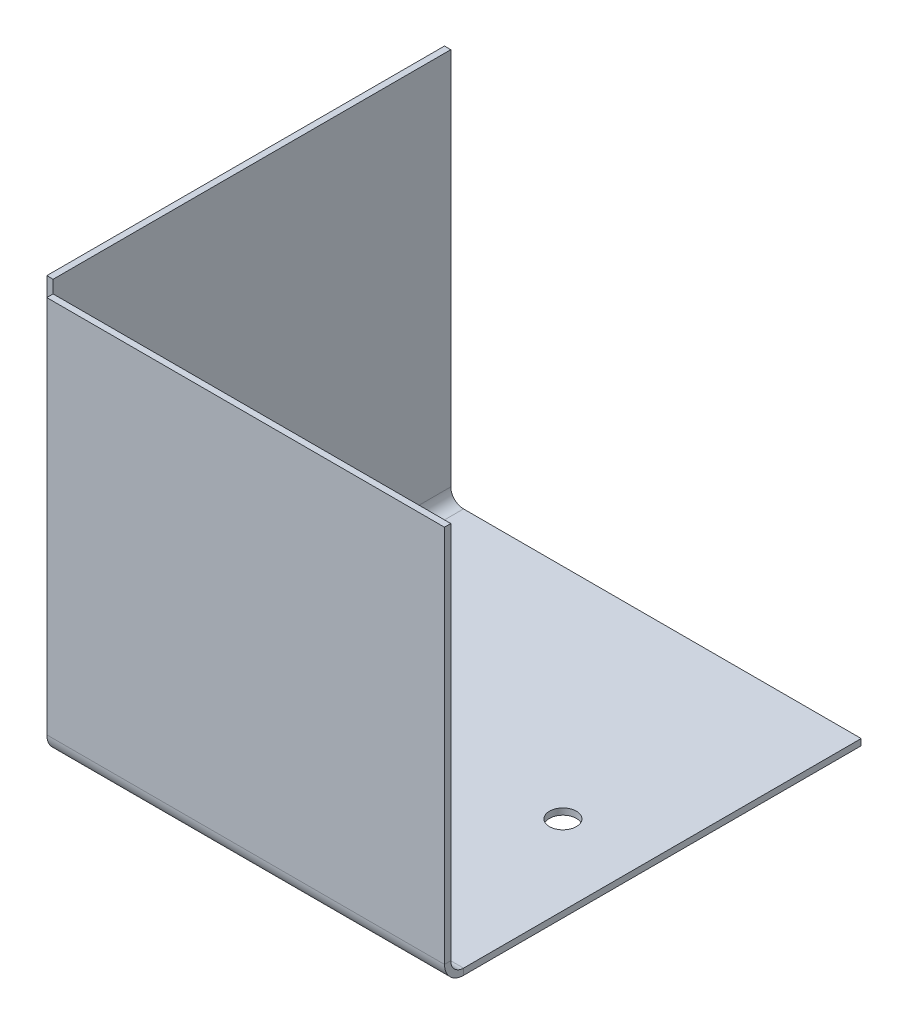
ISO-10303-21;
HEADER;
FILE_DESCRIPTION(('STEP AP214'),'2;1');
FILE_NAME('part.step','',(''),(''),'','','');
FILE_SCHEMA(('AUTOMOTIVE_DESIGN { 1 0 10303 214 1 1 1 1 }'));
ENDSEC;
DATA;
#1=APPLICATION_CONTEXT('core data for automotive mechanical design processes');
#2=APPLICATION_PROTOCOL_DEFINITION('international standard','automotive_design',2000,#1);
#3=PRODUCT_CONTEXT('',#1,'mechanical');
#4=PRODUCT('Part','Part','',(#3));
#5=PRODUCT_RELATED_PRODUCT_CATEGORY('part','',(#4));
#6=PRODUCT_DEFINITION_FORMATION('','',#4);
#7=PRODUCT_DEFINITION_CONTEXT('part definition',#1,'design');
#8=PRODUCT_DEFINITION('design','',#6,#7);
#9=PRODUCT_DEFINITION_SHAPE('','',#8);
#10=(LENGTH_UNIT() NAMED_UNIT(*) SI_UNIT(.MILLI.,.METRE.));
#11=(NAMED_UNIT(*) PLANE_ANGLE_UNIT() SI_UNIT($,.RADIAN.));
#12=(NAMED_UNIT(*) SI_UNIT($,.STERADIAN.) SOLID_ANGLE_UNIT());
#13=UNCERTAINTY_MEASURE_WITH_UNIT(LENGTH_MEASURE(1.E-05),#10,'distance_accuracy_value','');
#14=(GEOMETRIC_REPRESENTATION_CONTEXT(3) GLOBAL_UNCERTAINTY_ASSIGNED_CONTEXT((#13)) GLOBAL_UNIT_ASSIGNED_CONTEXT((#10,
#11,#12)) REPRESENTATION_CONTEXT('',''));
#15=CARTESIAN_POINT('',(0.,0.,0.));
#16=DIRECTION('',(0.,0.,1.));
#17=DIRECTION('',(1.,0.,0.));
#18=AXIS2_PLACEMENT_3D('',#15,#16,#17);
#19=CARTESIAN_POINT('',(50.,-1.5875,-50.));
#20=DIRECTION('',(1.,0.,0.));
#21=DIRECTION('',(0.,0.,-1.));
#22=AXIS2_PLACEMENT_3D('',#19,#20,#21);
#23=PLANE('',#22);
#24=DIRECTION('',(0.,0.,-1.));
#25=VECTOR('',#24,1.);
#26=CARTESIAN_POINT('',(50.,0.,-50.));
#27=LINE('',#26,#25);
#28=CARTESIAN_POINT('',(50.,0.,50.));
#29=VERTEX_POINT('',#28);
#30=CARTESIAN_POINT('',(50.,0.,-50.));
#31=VERTEX_POINT('',#30);
#32=EDGE_CURVE('E119',#29,#31,#27,.T.);
#33=ORIENTED_EDGE('',*,*,#32,.F.);
#34=DIRECTION('',(0.,1.,0.));
#35=VECTOR('',#34,1.);
#36=CARTESIAN_POINT('',(50.,-1.5875,50.));
#37=LINE('',#36,#35);
#38=CARTESIAN_POINT('',(50.,-1.58750000000002,50.));
#39=VERTEX_POINT('',#38);
#40=EDGE_CURVE('E13',#39,#29,#37,.T.);
#41=ORIENTED_EDGE('',*,*,#40,.F.);
#42=DIRECTION('',(0.,0.,-1.));
#43=VECTOR('',#42,1.);
#44=CARTESIAN_POINT('',(50.,-1.5875,-50.));
#45=LINE('',#44,#43);
#46=CARTESIAN_POINT('',(50.,-1.5875,-50.));
#47=VERTEX_POINT('',#46);
#48=EDGE_CURVE('E134',#39,#47,#45,.T.);
#49=ORIENTED_EDGE('',*,*,#48,.T.);
#50=DIRECTION('',(0.,1.,0.));
#51=VECTOR('',#50,1.);
#52=CARTESIAN_POINT('',(50.,-1.5875,-50.));
#53=LINE('',#52,#51);
#54=EDGE_CURVE('E80',#47,#31,#53,.T.);
#55=ORIENTED_EDGE('',*,*,#54,.T.);
#56=EDGE_LOOP('',(#33,#41,#49,#55));
#57=FACE_BOUND('',#56,.T.);
#58=ADVANCED_FACE('F77',(#57),#23,.T.);
#59=CARTESIAN_POINT('',(-50.,-1.5875,-50.));
#60=DIRECTION('',(0.,0.,-1.));
#61=DIRECTION('',(-1.,0.,0.));
#62=AXIS2_PLACEMENT_3D('',#59,#60,#61);
#63=PLANE('',#62);
#64=DIRECTION('',(-1.,0.,0.));
#65=VECTOR('',#64,1.);
#66=CARTESIAN_POINT('',(-50.,0.,-50.));
#67=LINE('',#66,#65);
#68=CARTESIAN_POINT('',(-50.,0.,-50.));
#69=VERTEX_POINT('',#68);
#70=EDGE_CURVE('E124',#31,#69,#67,.T.);
#71=ORIENTED_EDGE('',*,*,#70,.F.);
#72=ORIENTED_EDGE('',*,*,#54,.F.);
#73=DIRECTION('',(-1.,0.,0.));
#74=VECTOR('',#73,1.);
#75=CARTESIAN_POINT('',(-50.,-1.5875,-50.));
#76=LINE('',#75,#74);
#77=CARTESIAN_POINT('',(-50.,-1.5875,-50.));
#78=VERTEX_POINT('',#77);
#79=EDGE_CURVE('E208',#47,#78,#76,.T.);
#80=ORIENTED_EDGE('',*,*,#79,.T.);
#81=DIRECTION('',(0.,1.,0.));
#82=VECTOR('',#81,1.);
#83=CARTESIAN_POINT('',(-50.,-1.5875,-50.));
#84=LINE('',#83,#82);
#85=EDGE_CURVE('E215',#78,#69,#84,.T.);
#86=ORIENTED_EDGE('',*,*,#85,.T.);
#87=EDGE_LOOP('',(#71,#72,#80,#86));
#88=FACE_BOUND('',#87,.T.);
#89=ADVANCED_FACE('F218',(#88),#63,.T.);
#90=CARTESIAN_POINT('',(0.,-1.5875,0.));
#91=DIRECTION('',(0.,1.,0.));
#92=DIRECTION('',(0.,0.,1.));
#93=AXIS2_PLACEMENT_3D('',#90,#91,#92);
#94=PLANE('',#93);
#95=CARTESIAN_POINT('',(-30.,-1.58750000000002,4.99999999999999));
#96=DIRECTION('',(0.,1.,0.));
#97=DIRECTION('',(0.,0.,1.));
#98=AXIS2_PLACEMENT_3D('',#95,#96,#97);
#99=CIRCLE('',#98,3.3782);
#100=CARTESIAN_POINT('',(-30.,-1.58750000000002,8.37819999999999));
#101=VERTEX_POINT('',#100);
#102=EDGE_CURVE('E318',#101,#101,#99,.T.);
#103=ORIENTED_EDGE('',*,*,#102,.T.);
#104=EDGE_LOOP('',(#103));
#105=FACE_BOUND('',#104,.T.);
#106=CARTESIAN_POINT('',(30.,-1.58750000000002,4.99999999999999));
#107=DIRECTION('',(0.,1.,0.));
#108=DIRECTION('',(0.,0.,1.));
#109=AXIS2_PLACEMENT_3D('',#106,#107,#108);
#110=CIRCLE('',#109,3.3782);
#111=CARTESIAN_POINT('',(30.,-1.58750000000002,8.37819999999999));
#112=VERTEX_POINT('',#111);
#113=EDGE_CURVE('E288',#112,#112,#110,.T.);
#114=ORIENTED_EDGE('',*,*,#113,.T.);
#115=EDGE_LOOP('',(#114));
#116=FACE_BOUND('',#115,.T.);
#117=ORIENTED_EDGE('',*,*,#48,.F.);
#118=DIRECTION('',(1.,0.,0.));
#119=VECTOR('',#118,1.);
#120=CARTESIAN_POINT('',(-50.,-1.5875,50.));
#121=LINE('',#120,#119);
#122=CARTESIAN_POINT('',(-50.,-1.58750000000001,50.));
#123=VERTEX_POINT('',#122);
#124=EDGE_CURVE('E211',#123,#39,#121,.T.);
#125=ORIENTED_EDGE('',*,*,#124,.F.);
#126=DIRECTION('',(0.,0.,1.));
#127=VECTOR('',#126,1.);
#128=CARTESIAN_POINT('',(-50.,-1.5875,-50.));
#129=LINE('',#128,#127);
#130=EDGE_CURVE('E95',#78,#123,#129,.T.);
#131=ORIENTED_EDGE('',*,*,#130,.F.);
#132=ORIENTED_EDGE('',*,*,#79,.F.);
#133=EDGE_LOOP('',(#117,#125,#131,#132));
#134=FACE_BOUND('',#133,.T.);
#135=ADVANCED_FACE('F271',(#105,#116,#134),#94,.F.);
#136=CARTESIAN_POINT('',(0.,0.,0.));
#137=DIRECTION('',(0.,1.,0.));
#138=DIRECTION('',(0.,0.,1.));
#139=AXIS2_PLACEMENT_3D('',#136,#137,#138);
#140=PLANE('',#139);
#141=CARTESIAN_POINT('',(-30.,0.,4.99999999999999));
#142=DIRECTION('',(0.,1.,0.));
#143=DIRECTION('',(0.,0.,1.));
#144=AXIS2_PLACEMENT_3D('',#141,#142,#143);
#145=CIRCLE('',#144,3.3782);
#146=CARTESIAN_POINT('',(-30.,0.,8.37819999999999));
#147=VERTEX_POINT('',#146);
#148=EDGE_CURVE('E321',#147,#147,#145,.T.);
#149=ORIENTED_EDGE('',*,*,#148,.F.);
#150=EDGE_LOOP('',(#149));
#151=FACE_BOUND('',#150,.T.);
#152=CARTESIAN_POINT('',(30.,0.,4.99999999999999));
#153=DIRECTION('',(0.,1.,0.));
#154=DIRECTION('',(0.,0.,1.));
#155=AXIS2_PLACEMENT_3D('',#152,#153,#154);
#156=CIRCLE('',#155,3.3782);
#157=CARTESIAN_POINT('',(30.,0.,8.37819999999999));
#158=VERTEX_POINT('',#157);
#159=EDGE_CURVE('E315',#158,#158,#156,.T.);
#160=ORIENTED_EDGE('',*,*,#159,.F.);
#161=EDGE_LOOP('',(#160));
#162=FACE_BOUND('',#161,.T.);
#163=ORIENTED_EDGE('',*,*,#32,.T.);
#164=ORIENTED_EDGE('',*,*,#70,.T.);
#165=DIRECTION('',(0.,0.,1.));
#166=VECTOR('',#165,1.);
#167=CARTESIAN_POINT('',(-50.,0.,-50.));
#168=LINE('',#167,#166);
#169=CARTESIAN_POINT('',(-50.,0.,50.));
#170=VERTEX_POINT('',#169);
#171=EDGE_CURVE('E113',#69,#170,#168,.T.);
#172=ORIENTED_EDGE('',*,*,#171,.T.);
#173=DIRECTION('',(1.,0.,0.));
#174=VECTOR('',#173,1.);
#175=CARTESIAN_POINT('',(-50.,0.,50.));
#176=LINE('',#175,#174);
#177=EDGE_CURVE('E128',#170,#29,#176,.T.);
#178=ORIENTED_EDGE('',*,*,#177,.T.);
#179=EDGE_LOOP('',(#163,#164,#172,#178));
#180=FACE_BOUND('',#179,.T.);
#181=ADVANCED_FACE('F129',(#151,#162,#180),#140,.T.);
#182=CARTESIAN_POINT('',(-50.,3.2,-50.));
#183=DIRECTION('',(0.,0.,-1.));
#184=DIRECTION('',(-1.,0.,0.));
#185=AXIS2_PLACEMENT_3D('',#182,#183,#184);
#186=PLANE('',#185);
#187=DIRECTION('',(1.,0.,0.));
#188=VECTOR('',#187,1.);
#189=CARTESIAN_POINT('',(-54.7875,3.19999999999998,-50.));
#190=LINE('',#189,#188);
#191=CARTESIAN_POINT('',(-53.2,3.19999999999999,-50.));
#192=VERTEX_POINT('',#191);
#193=CARTESIAN_POINT('',(-54.7875,3.19999999999998,-50.));
#194=VERTEX_POINT('',#193);
#195=EDGE_CURVE('E193',#192,#194,#190,.F.);
#196=ORIENTED_EDGE('',*,*,#195,.F.);
#197=CARTESIAN_POINT('',(-50.,3.2,-50.));
#198=DIRECTION('',(0.,0.,1.));
#199=DIRECTION('',(1.,0.,0.));
#200=AXIS2_PLACEMENT_3D('',#197,#198,#199);
#201=CIRCLE('',#200,3.20000000000001);
#202=EDGE_CURVE('E202',#69,#192,#201,.F.);
#203=ORIENTED_EDGE('',*,*,#202,.F.);
#204=ORIENTED_EDGE('',*,*,#85,.F.);
#205=CARTESIAN_POINT('',(-50.,3.2,-50.));
#206=DIRECTION('',(0.,0.,1.));
#207=DIRECTION('',(1.,0.,0.));
#208=AXIS2_PLACEMENT_3D('',#205,#206,#207);
#209=CIRCLE('',#208,4.78750000000001);
#210=EDGE_CURVE('E125',#78,#194,#209,.F.);
#211=ORIENTED_EDGE('',*,*,#210,.T.);
#212=EDGE_LOOP('',(#196,#203,#204,#211));
#213=FACE_BOUND('',#212,.T.);
#214=ADVANCED_FACE('F228',(#213),#186,.T.);
#215=CARTESIAN_POINT('',(-50.,3.2,50.));
#216=DIRECTION('',(0.,0.,-1.));
#217=DIRECTION('',(-1.,0.,0.));
#218=AXIS2_PLACEMENT_3D('',#215,#216,#217);
#219=PLANE('',#218);
#220=CARTESIAN_POINT('',(-50.,3.2,50.));
#221=DIRECTION('',(0.,0.,1.));
#222=DIRECTION('',(1.,0.,0.));
#223=AXIS2_PLACEMENT_3D('',#220,#221,#222);
#224=CIRCLE('',#223,3.20000000000001);
#225=CARTESIAN_POINT('',(-53.2,3.19999999999999,50.));
#226=VERTEX_POINT('',#225);
#227=EDGE_CURVE('E162',#226,#170,#224,.T.);
#228=ORIENTED_EDGE('',*,*,#227,.F.);
#229=DIRECTION('',(1.,0.,0.));
#230=VECTOR('',#229,1.);
#231=CARTESIAN_POINT('',(-53.2,3.19999999999999,50.));
#232=LINE('',#231,#230);
#233=CARTESIAN_POINT('',(-54.7875,3.19999999999998,50.));
#234=VERTEX_POINT('',#233);
#235=EDGE_CURVE('E187',#226,#234,#232,.F.);
#236=ORIENTED_EDGE('',*,*,#235,.T.);
#237=CARTESIAN_POINT('',(-50.,3.2,50.));
#238=DIRECTION('',(0.,0.,1.));
#239=DIRECTION('',(1.,0.,0.));
#240=AXIS2_PLACEMENT_3D('',#237,#238,#239);
#241=CIRCLE('',#240,4.78750000000001);
#242=EDGE_CURVE('E199',#234,#123,#241,.T.);
#243=ORIENTED_EDGE('',*,*,#242,.T.);
#244=DIRECTION('',(0.,1.,0.));
#245=VECTOR('',#244,1.);
#246=CARTESIAN_POINT('',(-50.,-1.5875,50.));
#247=LINE('',#246,#245);
#248=EDGE_CURVE('E86',#123,#170,#247,.T.);
#249=ORIENTED_EDGE('',*,*,#248,.T.);
#250=EDGE_LOOP('',(#228,#236,#243,#249));
#251=FACE_BOUND('',#250,.T.);
#252=ADVANCED_FACE('F259',(#251),#219,.F.);
#253=CARTESIAN_POINT('',(-50.,3.2,50.));
#254=DIRECTION('',(0.,0.,1.));
#255=DIRECTION('',(-1.,0.,0.));
#256=AXIS2_PLACEMENT_3D('',#253,#254,#255);
#257=CYLINDRICAL_SURFACE('',#256,4.78750000000001);
#258=ORIENTED_EDGE('',*,*,#130,.T.);
#259=ORIENTED_EDGE('',*,*,#242,.F.);
#260=DIRECTION('',(0.,0.,1.));
#261=VECTOR('',#260,1.);
#262=CARTESIAN_POINT('',(-54.7875,3.19999999999998,-50.));
#263=LINE('',#262,#261);
#264=EDGE_CURVE('E184',#234,#194,#263,.F.);
#265=ORIENTED_EDGE('',*,*,#264,.T.);
#266=ORIENTED_EDGE('',*,*,#210,.F.);
#267=EDGE_LOOP('',(#258,#259,#265,#266));
#268=FACE_BOUND('',#267,.T.);
#269=ADVANCED_FACE('F274',(#268),#257,.T.);
#270=CARTESIAN_POINT('',(-50.,3.2,50.));
#271=DIRECTION('',(0.,0.,1.));
#272=DIRECTION('',(-1.,0.,0.));
#273=AXIS2_PLACEMENT_3D('',#270,#271,#272);
#274=CYLINDRICAL_SURFACE('',#273,3.20000000000001);
#275=ORIENTED_EDGE('',*,*,#171,.F.);
#276=ORIENTED_EDGE('',*,*,#202,.T.);
#277=DIRECTION('',(0.,0.,1.));
#278=VECTOR('',#277,1.);
#279=CARTESIAN_POINT('',(-53.2,3.19999999999999,-50.));
#280=LINE('',#279,#278);
#281=EDGE_CURVE('E190',#192,#226,#280,.T.);
#282=ORIENTED_EDGE('',*,*,#281,.T.);
#283=ORIENTED_EDGE('',*,*,#227,.T.);
#284=EDGE_LOOP('',(#275,#276,#282,#283));
#285=FACE_BOUND('',#284,.T.);
#286=ADVANCED_FACE('F223',(#285),#274,.F.);
#287=CARTESIAN_POINT('',(-54.7875,0.,-50.));
#288=DIRECTION('',(0.,0.,1.));
#289=DIRECTION('',(1.,0.,0.));
#290=AXIS2_PLACEMENT_3D('',#287,#288,#289);
#291=PLANE('',#290);
#292=ORIENTED_EDGE('',*,*,#195,.T.);
#293=DIRECTION('',(0.,-1.,0.));
#294=VECTOR('',#293,1.);
#295=CARTESIAN_POINT('',(-54.7875,-1.81813370697742E-13,-50.));
#296=LINE('',#295,#294);
#297=CARTESIAN_POINT('',(-54.7875000000003,98.4125,-50.));
#298=VERTEX_POINT('',#297);
#299=EDGE_CURVE('E172',#298,#194,#296,.T.);
#300=ORIENTED_EDGE('',*,*,#299,.F.);
#301=DIRECTION('',(1.,0.,0.));
#302=VECTOR('',#301,1.);
#303=CARTESIAN_POINT('',(-54.7875000000003,98.4125,-50.));
#304=LINE('',#303,#302);
#305=CARTESIAN_POINT('',(-53.2000000000003,98.4125,-50.));
#306=VERTEX_POINT('',#305);
#307=EDGE_CURVE('E163',#298,#306,#304,.T.);
#308=ORIENTED_EDGE('',*,*,#307,.T.);
#309=DIRECTION('',(0.,1.,0.));
#310=VECTOR('',#309,1.);
#311=CARTESIAN_POINT('',(-53.2,0.,-50.));
#312=LINE('',#311,#310);
#313=EDGE_CURVE('E181',#306,#192,#312,.F.);
#314=ORIENTED_EDGE('',*,*,#313,.T.);
#315=EDGE_LOOP('',(#292,#300,#308,#314));
#316=FACE_BOUND('',#315,.T.);
#317=ADVANCED_FACE('F235',(#316),#291,.F.);
#318=CARTESIAN_POINT('',(-54.7875000000003,98.4125,50.));
#319=DIRECTION('',(0.,0.,-1.));
#320=DIRECTION('',(-1.,0.,0.));
#321=AXIS2_PLACEMENT_3D('',#318,#319,#320);
#322=PLANE('',#321);
#323=ORIENTED_EDGE('',*,*,#235,.F.);
#324=DIRECTION('',(0.,-1.,0.));
#325=VECTOR('',#324,1.);
#326=CARTESIAN_POINT('',(-53.2000000000003,98.4125,50.));
#327=LINE('',#326,#325);
#328=CARTESIAN_POINT('',(-53.2000000000003,98.4125,50.));
#329=VERTEX_POINT('',#328);
#330=EDGE_CURVE('E178',#226,#329,#327,.F.);
#331=ORIENTED_EDGE('',*,*,#330,.T.);
#332=DIRECTION('',(1.,0.,0.));
#333=VECTOR('',#332,1.);
#334=CARTESIAN_POINT('',(-54.7875000000003,98.4125,50.));
#335=LINE('',#334,#333);
#336=CARTESIAN_POINT('',(-54.7875000000003,98.4125,50.));
#337=VERTEX_POINT('',#336);
#338=EDGE_CURVE('E159',#337,#329,#335,.T.);
#339=ORIENTED_EDGE('',*,*,#338,.F.);
#340=DIRECTION('',(0.,1.,0.));
#341=VECTOR('',#340,1.);
#342=CARTESIAN_POINT('',(-54.7875,-1.81813370697742E-13,50.));
#343=LINE('',#342,#341);
#344=EDGE_CURVE('E169',#234,#337,#343,.T.);
#345=ORIENTED_EDGE('',*,*,#344,.F.);
#346=EDGE_LOOP('',(#323,#331,#339,#345));
#347=FACE_BOUND('',#346,.T.);
#348=ADVANCED_FACE('F262',(#347),#322,.F.);
#349=CARTESIAN_POINT('',(-54.7875,-1.81813370697742E-13,0.));
#350=DIRECTION('',(1.,0.,0.));
#351=DIRECTION('',(0.,1.,0.));
#352=AXIS2_PLACEMENT_3D('',#349,#350,#351);
#353=PLANE('',#352);
#354=ORIENTED_EDGE('',*,*,#264,.F.);
#355=ORIENTED_EDGE('',*,*,#344,.T.);
#356=DIRECTION('',(0.,0.,-1.));
#357=VECTOR('',#356,1.);
#358=CARTESIAN_POINT('',(-54.7875000000003,98.4125,0.));
#359=LINE('',#358,#357);
#360=EDGE_CURVE('E166',#337,#298,#359,.T.);
#361=ORIENTED_EDGE('',*,*,#360,.T.);
#362=ORIENTED_EDGE('',*,*,#299,.T.);
#363=EDGE_LOOP('',(#354,#355,#361,#362));
#364=FACE_BOUND('',#363,.T.);
#365=ADVANCED_FACE('F240',(#364),#353,.F.);
#366=CARTESIAN_POINT('',(-53.2,-1.76270644072329E-13,0.));
#367=DIRECTION('',(1.,0.,0.));
#368=DIRECTION('',(0.,1.,0.));
#369=AXIS2_PLACEMENT_3D('',#366,#367,#368);
#370=PLANE('',#369);
#371=ORIENTED_EDGE('',*,*,#330,.F.);
#372=ORIENTED_EDGE('',*,*,#281,.F.);
#373=ORIENTED_EDGE('',*,*,#313,.F.);
#374=DIRECTION('',(0.,0.,1.));
#375=VECTOR('',#374,1.);
#376=CARTESIAN_POINT('',(-53.2000000000003,98.4125,-50.));
#377=LINE('',#376,#375);
#378=EDGE_CURVE('E175',#329,#306,#377,.F.);
#379=ORIENTED_EDGE('',*,*,#378,.F.);
#380=EDGE_LOOP('',(#371,#372,#373,#379));
#381=FACE_BOUND('',#380,.T.);
#382=ADVANCED_FACE('F256',(#381),#370,.T.);
#383=CARTESIAN_POINT('',(-54.7875000000003,98.4125,-50.));
#384=DIRECTION('',(0.,-1.,0.));
#385=DIRECTION('',(1.,0.,0.));
#386=AXIS2_PLACEMENT_3D('',#383,#384,#385);
#387=PLANE('',#386);
#388=ORIENTED_EDGE('',*,*,#378,.T.);
#389=ORIENTED_EDGE('',*,*,#307,.F.);
#390=ORIENTED_EDGE('',*,*,#360,.F.);
#391=ORIENTED_EDGE('',*,*,#338,.T.);
#392=EDGE_LOOP('',(#388,#389,#390,#391));
#393=FACE_BOUND('',#392,.T.);
#394=ADVANCED_FACE('F249',(#393),#387,.F.);
#395=CARTESIAN_POINT('',(-50.,3.19999999999999,50.));
#396=DIRECTION('',(-1.,0.,0.));
#397=DIRECTION('',(0.,-1.,0.));
#398=AXIS2_PLACEMENT_3D('',#395,#396,#397);
#399=PLANE('',#398);
#400=DIRECTION('',(0.,0.,-1.));
#401=VECTOR('',#400,1.);
#402=CARTESIAN_POINT('',(-50.,3.19999999999999,54.7875));
#403=LINE('',#402,#401);
#404=CARTESIAN_POINT('',(-50.,3.19999999999999,53.2));
#405=VERTEX_POINT('',#404);
#406=CARTESIAN_POINT('',(-49.9999999999999,3.19999999999999,54.7875));
#407=VERTEX_POINT('',#406);
#408=EDGE_CURVE('E286',#405,#407,#403,.F.);
#409=ORIENTED_EDGE('',*,*,#408,.F.);
#410=CARTESIAN_POINT('',(-50.,3.19999999999999,50.));
#411=DIRECTION('',(1.,0.,0.));
#412=DIRECTION('',(0.,1.,0.));
#413=AXIS2_PLACEMENT_3D('',#410,#411,#412);
#414=CIRCLE('',#413,3.19999999999999);
#415=EDGE_CURVE('E150',#170,#405,#414,.F.);
#416=ORIENTED_EDGE('',*,*,#415,.F.);
#417=ORIENTED_EDGE('',*,*,#248,.F.);
#418=CARTESIAN_POINT('',(-49.9999999999999,3.19999999999999,50.));
#419=DIRECTION('',(1.,0.,0.));
#420=DIRECTION('',(0.,1.,0.));
#421=AXIS2_PLACEMENT_3D('',#418,#419,#420);
#422=CIRCLE('',#421,4.7875);
#423=EDGE_CURVE('E196',#123,#407,#422,.F.);
#424=ORIENTED_EDGE('',*,*,#423,.T.);
#425=EDGE_LOOP('',(#409,#416,#417,#424));
#426=FACE_BOUND('',#425,.T.);
#427=ADVANCED_FACE('F278',(#426),#399,.T.);
#428=CARTESIAN_POINT('',(50.,3.19999999999998,50.));
#429=DIRECTION('',(-1.,0.,0.));
#430=DIRECTION('',(0.,-1.,0.));
#431=AXIS2_PLACEMENT_3D('',#428,#429,#430);
#432=PLANE('',#431);
#433=CARTESIAN_POINT('',(50.,3.19999999999998,50.));
#434=DIRECTION('',(1.,0.,0.));
#435=DIRECTION('',(0.,1.,0.));
#436=AXIS2_PLACEMENT_3D('',#433,#434,#435);
#437=CIRCLE('',#436,3.19999999999999);
#438=CARTESIAN_POINT('',(50.,3.19999999999998,53.2));
#439=VERTEX_POINT('',#438);
#440=EDGE_CURVE('E142',#439,#29,#437,.T.);
#441=ORIENTED_EDGE('',*,*,#440,.F.);
#442=DIRECTION('',(0.,0.,-1.));
#443=VECTOR('',#442,1.);
#444=CARTESIAN_POINT('',(50.,3.19999999999998,53.2));
#445=LINE('',#444,#443);
#446=CARTESIAN_POINT('',(50.,3.19999999999998,54.7875));
#447=VERTEX_POINT('',#446);
#448=EDGE_CURVE('E290',#439,#447,#445,.F.);
#449=ORIENTED_EDGE('',*,*,#448,.T.);
#450=CARTESIAN_POINT('',(50.,3.19999999999998,50.));
#451=DIRECTION('',(1.,0.,0.));
#452=DIRECTION('',(0.,1.,0.));
#453=AXIS2_PLACEMENT_3D('',#450,#451,#452);
#454=CIRCLE('',#453,4.7875);
#455=EDGE_CURVE('E145',#447,#39,#454,.T.);
#456=ORIENTED_EDGE('',*,*,#455,.T.);
#457=ORIENTED_EDGE('',*,*,#40,.T.);
#458=EDGE_LOOP('',(#441,#449,#456,#457));
#459=FACE_BOUND('',#458,.T.);
#460=ADVANCED_FACE('F139',(#459),#432,.F.);
#461=CARTESIAN_POINT('',(50.,3.19999999999998,50.));
#462=DIRECTION('',(1.,0.,0.));
#463=DIRECTION('',(0.,0.,1.));
#464=AXIS2_PLACEMENT_3D('',#461,#462,#463);
#465=CYLINDRICAL_SURFACE('',#464,4.7875);
#466=ORIENTED_EDGE('',*,*,#124,.T.);
#467=ORIENTED_EDGE('',*,*,#455,.F.);
#468=DIRECTION('',(1.,0.,0.));
#469=VECTOR('',#468,1.);
#470=CARTESIAN_POINT('',(-50.,3.19999999999999,54.7875));
#471=LINE('',#470,#469);
#472=EDGE_CURVE('E283',#447,#407,#471,.F.);
#473=ORIENTED_EDGE('',*,*,#472,.T.);
#474=ORIENTED_EDGE('',*,*,#423,.F.);
#475=EDGE_LOOP('',(#466,#467,#473,#474));
#476=FACE_BOUND('',#475,.T.);
#477=ADVANCED_FACE('F281',(#476),#465,.T.);
#478=CARTESIAN_POINT('',(50.,3.19999999999998,50.));
#479=DIRECTION('',(1.,0.,0.));
#480=DIRECTION('',(0.,0.,1.));
#481=AXIS2_PLACEMENT_3D('',#478,#479,#480);
#482=CYLINDRICAL_SURFACE('',#481,3.19999999999999);
#483=ORIENTED_EDGE('',*,*,#177,.F.);
#484=ORIENTED_EDGE('',*,*,#415,.T.);
#485=DIRECTION('',(1.,0.,0.));
#486=VECTOR('',#485,1.);
#487=CARTESIAN_POINT('',(-50.,3.19999999999999,53.2));
#488=LINE('',#487,#486);
#489=EDGE_CURVE('E149',#405,#439,#488,.T.);
#490=ORIENTED_EDGE('',*,*,#489,.T.);
#491=ORIENTED_EDGE('',*,*,#440,.T.);
#492=EDGE_LOOP('',(#483,#484,#490,#491));
#493=FACE_BOUND('',#492,.T.);
#494=ADVANCED_FACE('F147',(#493),#482,.F.);
#495=CARTESIAN_POINT('',(50.,98.4125,54.7875));
#496=DIRECTION('',(-1.,0.,0.));
#497=DIRECTION('',(0.,0.,1.));
#498=AXIS2_PLACEMENT_3D('',#495,#496,#497);
#499=PLANE('',#498);
#500=ORIENTED_EDGE('',*,*,#448,.F.);
#501=DIRECTION('',(0.,-1.,0.));
#502=VECTOR('',#501,1.);
#503=CARTESIAN_POINT('',(50.,98.4125,53.2));
#504=LINE('',#503,#502);
#505=CARTESIAN_POINT('',(50.,98.4125,53.2));
#506=VERTEX_POINT('',#505);
#507=EDGE_CURVE('E293',#439,#506,#504,.F.);
#508=ORIENTED_EDGE('',*,*,#507,.T.);
#509=DIRECTION('',(0.,0.,-1.));
#510=VECTOR('',#509,1.);
#511=CARTESIAN_POINT('',(50.,98.4125,54.7875));
#512=LINE('',#511,#510);
#513=CARTESIAN_POINT('',(50.,98.4125,54.7875));
#514=VERTEX_POINT('',#513);
#515=EDGE_CURVE('E151',#514,#506,#512,.T.);
#516=ORIENTED_EDGE('',*,*,#515,.F.);
#517=DIRECTION('',(0.,1.,0.));
#518=VECTOR('',#517,1.);
#519=CARTESIAN_POINT('',(50.,0.,54.7875));
#520=LINE('',#519,#518);
#521=EDGE_CURVE('E302',#447,#514,#520,.T.);
#522=ORIENTED_EDGE('',*,*,#521,.F.);
#523=EDGE_LOOP('',(#500,#508,#516,#522));
#524=FACE_BOUND('',#523,.T.);
#525=ADVANCED_FACE('F382',(#524),#499,.F.);
#526=CARTESIAN_POINT('',(-50.,0.,54.7875));
#527=DIRECTION('',(1.,0.,0.));
#528=DIRECTION('',(0.,0.,-1.));
#529=AXIS2_PLACEMENT_3D('',#526,#527,#528);
#530=PLANE('',#529);
#531=ORIENTED_EDGE('',*,*,#408,.T.);
#532=DIRECTION('',(0.,-1.,0.));
#533=VECTOR('',#532,1.);
#534=CARTESIAN_POINT('',(-50.,0.,54.7875));
#535=LINE('',#534,#533);
#536=CARTESIAN_POINT('',(-50.,98.4125,54.7875));
#537=VERTEX_POINT('',#536);
#538=EDGE_CURVE('E308',#537,#407,#535,.T.);
#539=ORIENTED_EDGE('',*,*,#538,.F.);
#540=DIRECTION('',(0.,0.,-1.));
#541=VECTOR('',#540,1.);
#542=CARTESIAN_POINT('',(-50.,98.4125,54.7875));
#543=LINE('',#542,#541);
#544=CARTESIAN_POINT('',(-50.,98.4125,53.2));
#545=VERTEX_POINT('',#544);
#546=EDGE_CURVE('E155',#537,#545,#543,.T.);
#547=ORIENTED_EDGE('',*,*,#546,.T.);
#548=DIRECTION('',(0.,1.,0.));
#549=VECTOR('',#548,1.);
#550=CARTESIAN_POINT('',(-50.,0.,53.2));
#551=LINE('',#550,#549);
#552=EDGE_CURVE('E299',#545,#405,#551,.F.);
#553=ORIENTED_EDGE('',*,*,#552,.T.);
#554=EDGE_LOOP('',(#531,#539,#547,#553));
#555=FACE_BOUND('',#554,.T.);
#556=ADVANCED_FACE('F386',(#555),#530,.F.);
#557=CARTESIAN_POINT('',(0.,0.,54.7875));
#558=DIRECTION('',(0.,0.,-1.));
#559=DIRECTION('',(-1.,0.,0.));
#560=AXIS2_PLACEMENT_3D('',#557,#558,#559);
#561=PLANE('',#560);
#562=ORIENTED_EDGE('',*,*,#472,.F.);
#563=ORIENTED_EDGE('',*,*,#521,.T.);
#564=DIRECTION('',(-1.,0.,0.));
#565=VECTOR('',#564,1.);
#566=CARTESIAN_POINT('',(0.,98.4125,54.7875));
#567=LINE('',#566,#565);
#568=EDGE_CURVE('E305',#514,#537,#567,.T.);
#569=ORIENTED_EDGE('',*,*,#568,.T.);
#570=ORIENTED_EDGE('',*,*,#538,.T.);
#571=EDGE_LOOP('',(#562,#563,#569,#570));
#572=FACE_BOUND('',#571,.T.);
#573=ADVANCED_FACE('F391',(#572),#561,.F.);
#574=CARTESIAN_POINT('',(0.,0.,53.2));
#575=DIRECTION('',(0.,0.,-1.));
#576=DIRECTION('',(-1.,0.,0.));
#577=AXIS2_PLACEMENT_3D('',#574,#575,#576);
#578=PLANE('',#577);
#579=ORIENTED_EDGE('',*,*,#507,.F.);
#580=ORIENTED_EDGE('',*,*,#489,.F.);
#581=ORIENTED_EDGE('',*,*,#552,.F.);
#582=DIRECTION('',(1.,0.,0.));
#583=VECTOR('',#582,1.);
#584=CARTESIAN_POINT('',(-50.,98.4125,53.2));
#585=LINE('',#584,#583);
#586=EDGE_CURVE('E296',#506,#545,#585,.F.);
#587=ORIENTED_EDGE('',*,*,#586,.F.);
#588=EDGE_LOOP('',(#579,#580,#581,#587));
#589=FACE_BOUND('',#588,.T.);
#590=ADVANCED_FACE('F343',(#589),#578,.T.);
#591=CARTESIAN_POINT('',(-50.,98.4125,54.7875));
#592=DIRECTION('',(0.,-1.,0.));
#593=DIRECTION('',(0.,0.,-1.));
#594=AXIS2_PLACEMENT_3D('',#591,#592,#593);
#595=PLANE('',#594);
#596=ORIENTED_EDGE('',*,*,#586,.T.);
#597=ORIENTED_EDGE('',*,*,#546,.F.);
#598=ORIENTED_EDGE('',*,*,#568,.F.);
#599=ORIENTED_EDGE('',*,*,#515,.T.);
#600=EDGE_LOOP('',(#596,#597,#598,#599));
#601=FACE_BOUND('',#600,.T.);
#602=ADVANCED_FACE('F334',(#601),#595,.F.);
#603=CARTESIAN_POINT('',(30.,0.,4.99999999999999));
#604=DIRECTION('',(0.,1.,0.));
#605=DIRECTION('',(0.,0.,1.));
#606=AXIS2_PLACEMENT_3D('',#603,#604,#605);
#607=CYLINDRICAL_SURFACE('',#606,3.3782);
#608=ORIENTED_EDGE('',*,*,#113,.F.);
#609=EDGE_LOOP('',(#608));
#610=FACE_BOUND('',#609,.T.);
#611=ORIENTED_EDGE('',*,*,#159,.T.);
#612=EDGE_LOOP('',(#611));
#613=FACE_BOUND('',#612,.T.);
#614=ADVANCED_FACE('F332',(#610,#613),#607,.F.);
#615=CARTESIAN_POINT('',(-30.,0.,4.99999999999999));
#616=DIRECTION('',(0.,1.,0.));
#617=DIRECTION('',(0.,0.,1.));
#618=AXIS2_PLACEMENT_3D('',#615,#616,#617);
#619=CYLINDRICAL_SURFACE('',#618,3.3782);
#620=ORIENTED_EDGE('',*,*,#102,.F.);
#621=EDGE_LOOP('',(#620));
#622=FACE_BOUND('',#621,.T.);
#623=ORIENTED_EDGE('',*,*,#148,.T.);
#624=EDGE_LOOP('',(#623));
#625=FACE_BOUND('',#624,.T.);
#626=ADVANCED_FACE('F325',(#622,#625),#619,.F.);
#627=CLOSED_SHELL('',(#58,#89,#135,#181,#214,#252,#269,#286,#317,#348,#365,#382,#394,#427,#460,
#477,#494,#525,#556,#573,#590,#602,#614,#626));
#628=MANIFOLD_SOLID_BREP('B2',#627);
#629=ADVANCED_BREP_SHAPE_REPRESENTATION('',(#18,#628),#14);
#630=SHAPE_DEFINITION_REPRESENTATION(#9,#629);
ENDSEC;
END-ISO-10303-21;
